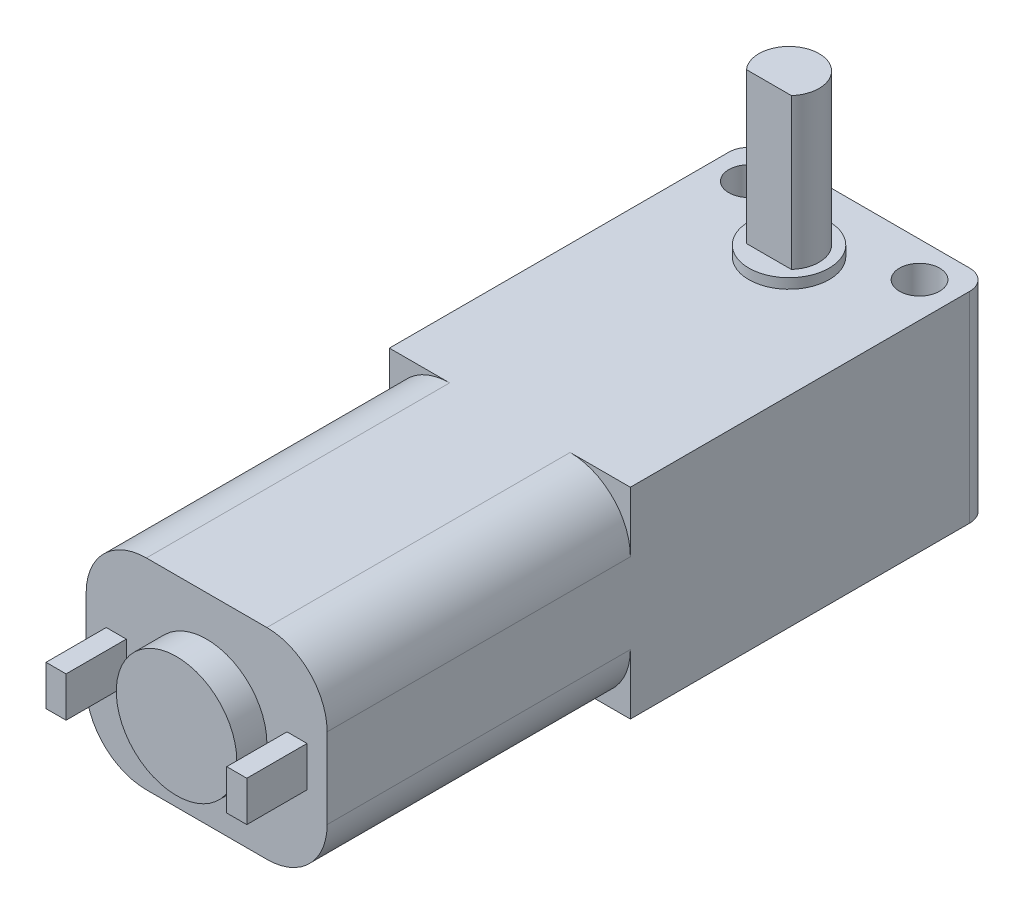
ISO-10303-21;
HEADER;
FILE_DESCRIPTION(('STEP AP214'),'2;1');
FILE_NAME('part.step','',(''),(''),'','','');
FILE_SCHEMA(('AUTOMOTIVE_DESIGN { 1 0 10303 214 1 1 1 1 }'));
ENDSEC;
DATA;
#1=APPLICATION_CONTEXT('core data for automotive mechanical design processes');
#2=APPLICATION_PROTOCOL_DEFINITION('international standard','automotive_design',2000,#1);
#3=PRODUCT_CONTEXT('',#1,'mechanical');
#4=PRODUCT('Part','Part','',(#3));
#5=PRODUCT_RELATED_PRODUCT_CATEGORY('part','',(#4));
#6=PRODUCT_DEFINITION_FORMATION('','',#4);
#7=PRODUCT_DEFINITION_CONTEXT('part definition',#1,'design');
#8=PRODUCT_DEFINITION('design','',#6,#7);
#9=PRODUCT_DEFINITION_SHAPE('','',#8);
#10=(LENGTH_UNIT() NAMED_UNIT(*) SI_UNIT(.MILLI.,.METRE.));
#11=(NAMED_UNIT(*) PLANE_ANGLE_UNIT() SI_UNIT($,.RADIAN.));
#12=(NAMED_UNIT(*) SI_UNIT($,.STERADIAN.) SOLID_ANGLE_UNIT());
#13=UNCERTAINTY_MEASURE_WITH_UNIT(LENGTH_MEASURE(1.E-05),#10,'distance_accuracy_value','');
#14=(GEOMETRIC_REPRESENTATION_CONTEXT(3) GLOBAL_UNCERTAINTY_ASSIGNED_CONTEXT((#13)) GLOBAL_UNIT_ASSIGNED_CONTEXT((#10,
#11,#12)) REPRESENTATION_CONTEXT('',''));
#15=CARTESIAN_POINT('',(0.,0.,0.));
#16=DIRECTION('',(0.,0.,1.));
#17=DIRECTION('',(1.,0.,0.));
#18=AXIS2_PLACEMENT_3D('',#15,#16,#17);
#19=CARTESIAN_POINT('',(-6.,10.,16.5));
#20=DIRECTION('',(0.,0.,-1.));
#21=DIRECTION('',(-1.,0.,0.));
#22=AXIS2_PLACEMENT_3D('',#19,#20,#21);
#23=PLANE('',#22);
#24=DIRECTION('',(0.,-1.,0.));
#25=VECTOR('',#24,1.);
#26=CARTESIAN_POINT('',(-5.,5.99999999999999,16.5));
#27=LINE('',#26,#25);
#28=CARTESIAN_POINT('',(-5.,5.99999999999999,16.5));
#29=VERTEX_POINT('',#28);
#30=CARTESIAN_POINT('',(-5.,3.99999999999999,16.5));
#31=VERTEX_POINT('',#30);
#32=EDGE_CURVE('E305',#29,#31,#27,.T.);
#33=ORIENTED_EDGE('',*,*,#32,.F.);
#34=DIRECTION('',(-1.,0.,0.));
#35=VECTOR('',#34,1.);
#36=CARTESIAN_POINT('',(-5.,5.99999999999999,16.5));
#37=LINE('',#36,#35);
#38=CARTESIAN_POINT('',(-4.,5.99999999999999,16.5));
#39=VERTEX_POINT('',#38);
#40=EDGE_CURVE('E310',#39,#29,#37,.T.);
#41=ORIENTED_EDGE('',*,*,#40,.F.);
#42=DIRECTION('',(0.,1.,0.));
#43=VECTOR('',#42,1.);
#44=CARTESIAN_POINT('',(-4.,5.99999999999999,16.5));
#45=LINE('',#44,#43);
#46=CARTESIAN_POINT('',(-4.,3.99999999999999,16.5));
#47=VERTEX_POINT('',#46);
#48=EDGE_CURVE('E322',#47,#39,#45,.T.);
#49=ORIENTED_EDGE('',*,*,#48,.F.);
#50=DIRECTION('',(1.,0.,0.));
#51=VECTOR('',#50,1.);
#52=CARTESIAN_POINT('',(-5.,3.99999999999999,16.5));
#53=LINE('',#52,#51);
#54=EDGE_CURVE('E319',#31,#47,#53,.T.);
#55=ORIENTED_EDGE('',*,*,#54,.F.);
#56=EDGE_LOOP('',(#33,#41,#49,#55));
#57=FACE_BOUND('',#56,.T.);
#58=CARTESIAN_POINT('',(0.,4.99999999999999,16.5));
#59=DIRECTION('',(0.,0.,1.));
#60=DIRECTION('',(1.,0.,0.));
#61=AXIS2_PLACEMENT_3D('',#58,#59,#60);
#62=CIRCLE('',#61,3.);
#63=CARTESIAN_POINT('',(3.,4.99999999999999,16.5));
#64=VERTEX_POINT('',#63);
#65=EDGE_CURVE('E255',#64,#64,#62,.T.);
#66=ORIENTED_EDGE('',*,*,#65,.F.);
#67=EDGE_LOOP('',(#66));
#68=FACE_BOUND('',#67,.T.);
#69=CARTESIAN_POINT('',(-3.,7.,16.5));
#70=DIRECTION('',(0.,0.,1.));
#71=DIRECTION('',(1.,0.,0.));
#72=AXIS2_PLACEMENT_3D('',#69,#70,#71);
#73=CIRCLE('',#72,3.);
#74=CARTESIAN_POINT('',(-3.,10.,16.5));
#75=VERTEX_POINT('',#74);
#76=CARTESIAN_POINT('',(-6.,6.99999999999998,16.5));
#77=VERTEX_POINT('',#76);
#78=EDGE_CURVE('E340',#75,#77,#73,.T.);
#79=ORIENTED_EDGE('',*,*,#78,.T.);
#80=DIRECTION('',(0.,-1.,0.));
#81=VECTOR('',#80,1.);
#82=CARTESIAN_POINT('',(-6.,10.,16.5));
#83=LINE('',#82,#81);
#84=CARTESIAN_POINT('',(-6.,3.00000000000002,16.5));
#85=VERTEX_POINT('',#84);
#86=EDGE_CURVE('E415',#77,#85,#83,.T.);
#87=ORIENTED_EDGE('',*,*,#86,.T.);
#88=CARTESIAN_POINT('',(-3.,3.,16.5));
#89=DIRECTION('',(0.,0.,1.));
#90=DIRECTION('',(1.,0.,0.));
#91=AXIS2_PLACEMENT_3D('',#88,#89,#90);
#92=CIRCLE('',#91,3.);
#93=CARTESIAN_POINT('',(-2.99999999999998,0.,16.5));
#94=VERTEX_POINT('',#93);
#95=EDGE_CURVE('E356',#85,#94,#92,.T.);
#96=ORIENTED_EDGE('',*,*,#95,.T.);
#97=DIRECTION('',(1.,0.,0.));
#98=VECTOR('',#97,1.);
#99=CARTESIAN_POINT('',(-6.,0.,16.5));
#100=LINE('',#99,#98);
#101=CARTESIAN_POINT('',(3.,0.,16.5));
#102=VERTEX_POINT('',#101);
#103=EDGE_CURVE('E406',#94,#102,#100,.T.);
#104=ORIENTED_EDGE('',*,*,#103,.T.);
#105=CARTESIAN_POINT('',(3.,3.,16.5));
#106=DIRECTION('',(0.,0.,1.));
#107=DIRECTION('',(1.,0.,0.));
#108=AXIS2_PLACEMENT_3D('',#105,#106,#107);
#109=CIRCLE('',#108,3.);
#110=CARTESIAN_POINT('',(6.,3.,16.5));
#111=VERTEX_POINT('',#110);
#112=EDGE_CURVE('E359',#102,#111,#109,.T.);
#113=ORIENTED_EDGE('',*,*,#112,.T.);
#114=DIRECTION('',(0.,-1.,0.));
#115=VECTOR('',#114,1.);
#116=CARTESIAN_POINT('',(6.,10.,16.5));
#117=LINE('',#116,#115);
#118=CARTESIAN_POINT('',(6.,6.99999999999998,16.5));
#119=VERTEX_POINT('',#118);
#120=EDGE_CURVE('E403',#119,#111,#117,.T.);
#121=ORIENTED_EDGE('',*,*,#120,.F.);
#122=CARTESIAN_POINT('',(3.,7.,16.5));
#123=DIRECTION('',(0.,0.,-1.));
#124=DIRECTION('',(-1.,0.,0.));
#125=AXIS2_PLACEMENT_3D('',#122,#123,#124);
#126=CIRCLE('',#125,3.);
#127=CARTESIAN_POINT('',(2.99999999999998,10.,16.5));
#128=VERTEX_POINT('',#127);
#129=EDGE_CURVE('E346',#128,#119,#126,.T.);
#130=ORIENTED_EDGE('',*,*,#129,.F.);
#131=DIRECTION('',(1.,0.,0.));
#132=VECTOR('',#131,1.);
#133=CARTESIAN_POINT('',(-6.,10.,16.5));
#134=LINE('',#133,#132);
#135=EDGE_CURVE('E395',#75,#128,#134,.T.);
#136=ORIENTED_EDGE('',*,*,#135,.F.);
#137=EDGE_LOOP('',(#79,#87,#96,#104,#113,#121,#130,#136));
#138=FACE_BOUND('',#137,.T.);
#139=DIRECTION('',(0.,1.,0.));
#140=VECTOR('',#139,1.);
#141=CARTESIAN_POINT('',(4.99999999999999,6.,16.5));
#142=LINE('',#141,#140);
#143=CARTESIAN_POINT('',(4.99999999999999,4.,16.5));
#144=VERTEX_POINT('',#143);
#145=CARTESIAN_POINT('',(4.99999999999999,6.,16.5));
#146=VERTEX_POINT('',#145);
#147=EDGE_CURVE('E269',#144,#146,#142,.T.);
#148=ORIENTED_EDGE('',*,*,#147,.F.);
#149=DIRECTION('',(1.,0.,0.));
#150=VECTOR('',#149,1.);
#151=CARTESIAN_POINT('',(4.99999999999999,4.,16.5));
#152=LINE('',#151,#150);
#153=CARTESIAN_POINT('',(3.99999999999999,4.,16.5));
#154=VERTEX_POINT('',#153);
#155=EDGE_CURVE('E277',#154,#144,#152,.T.);
#156=ORIENTED_EDGE('',*,*,#155,.F.);
#157=DIRECTION('',(0.,-1.,0.));
#158=VECTOR('',#157,1.);
#159=CARTESIAN_POINT('',(3.99999999999999,6.,16.5));
#160=LINE('',#159,#158);
#161=CARTESIAN_POINT('',(3.99999999999999,6.,16.5));
#162=VERTEX_POINT('',#161);
#163=EDGE_CURVE('E289',#162,#154,#160,.T.);
#164=ORIENTED_EDGE('',*,*,#163,.F.);
#165=DIRECTION('',(-1.,0.,0.));
#166=VECTOR('',#165,1.);
#167=CARTESIAN_POINT('',(4.99999999999999,6.,16.5));
#168=LINE('',#167,#166);
#169=EDGE_CURVE('E286',#146,#162,#168,.T.);
#170=ORIENTED_EDGE('',*,*,#169,.F.);
#171=EDGE_LOOP('',(#148,#156,#164,#170));
#172=FACE_BOUND('',#171,.T.);
#173=ADVANCED_FACE('F71',(#57,#68,#138,#172),#23,.F.);
#174=CARTESIAN_POINT('',(-6.,10.,-16.5));
#175=DIRECTION('',(1.,0.,0.));
#176=DIRECTION('',(0.,0.,-1.));
#177=AXIS2_PLACEMENT_3D('',#174,#175,#176);
#178=PLANE('',#177);
#179=DIRECTION('',(0.,0.,1.));
#180=VECTOR('',#179,1.);
#181=CARTESIAN_POINT('',(-6.,10.,-16.5));
#182=LINE('',#181,#180);
#183=CARTESIAN_POINT('',(-6.,10.,-15.5));
#184=VERTEX_POINT('',#183);
#185=CARTESIAN_POINT('',(-6.,10.,1.4));
#186=VERTEX_POINT('',#185);
#187=EDGE_CURVE('E393',#184,#186,#182,.T.);
#188=ORIENTED_EDGE('',*,*,#187,.F.);
#189=DIRECTION('',(0.,-1.,0.));
#190=VECTOR('',#189,1.);
#191=CARTESIAN_POINT('',(-6.,10.,-15.5));
#192=LINE('',#191,#190);
#193=CARTESIAN_POINT('',(-6.,0.,-15.5));
#194=VERTEX_POINT('',#193);
#195=EDGE_CURVE('E13',#184,#194,#192,.T.);
#196=ORIENTED_EDGE('',*,*,#195,.T.);
#197=DIRECTION('',(0.,0.,1.));
#198=VECTOR('',#197,1.);
#199=CARTESIAN_POINT('',(-6.,0.,-16.5));
#200=LINE('',#199,#198);
#201=CARTESIAN_POINT('',(-6.,0.,1.4));
#202=VERTEX_POINT('',#201);
#203=EDGE_CURVE('E404',#194,#202,#200,.T.);
#204=ORIENTED_EDGE('',*,*,#203,.T.);
#205=DIRECTION('',(0.,-1.,0.));
#206=VECTOR('',#205,1.);
#207=CARTESIAN_POINT('',(-6.,10.,1.4));
#208=LINE('',#207,#206);
#209=CARTESIAN_POINT('',(-6.,3.00000000000002,1.4));
#210=VERTEX_POINT('',#209);
#211=EDGE_CURVE('E384',#210,#202,#208,.T.);
#212=ORIENTED_EDGE('',*,*,#211,.F.);
#213=DIRECTION('',(0.,0.,1.));
#214=VECTOR('',#213,1.);
#215=CARTESIAN_POINT('',(-6.,3.00000000000002,1.4));
#216=LINE('',#215,#214);
#217=EDGE_CURVE('E379',#210,#85,#216,.T.);
#218=ORIENTED_EDGE('',*,*,#217,.T.);
#219=ORIENTED_EDGE('',*,*,#86,.F.);
#220=DIRECTION('',(0.,0.,1.));
#221=VECTOR('',#220,1.);
#222=CARTESIAN_POINT('',(-6.,6.99999999999998,1.4));
#223=LINE('',#222,#221);
#224=CARTESIAN_POINT('',(-6.,6.99999999999998,1.4));
#225=VERTEX_POINT('',#224);
#226=EDGE_CURVE('E353',#225,#77,#223,.T.);
#227=ORIENTED_EDGE('',*,*,#226,.F.);
#228=EDGE_CURVE('E389',#186,#225,#208,.T.);
#229=ORIENTED_EDGE('',*,*,#228,.F.);
#230=EDGE_LOOP('',(#188,#196,#204,#212,#218,#219,#227,#229));
#231=FACE_BOUND('',#230,.T.);
#232=ADVANCED_FACE('F463',(#231),#178,.F.);
#233=CARTESIAN_POINT('',(6.,10.,-16.5));
#234=DIRECTION('',(-1.,0.,0.));
#235=DIRECTION('',(0.,0.,1.));
#236=AXIS2_PLACEMENT_3D('',#233,#234,#235);
#237=PLANE('',#236);
#238=DIRECTION('',(0.,0.,-1.));
#239=VECTOR('',#238,1.);
#240=CARTESIAN_POINT('',(6.,0.,-16.5));
#241=LINE('',#240,#239);
#242=CARTESIAN_POINT('',(6.,0.,1.4));
#243=VERTEX_POINT('',#242);
#244=CARTESIAN_POINT('',(6.,0.,-15.5));
#245=VERTEX_POINT('',#244);
#246=EDGE_CURVE('E409',#243,#245,#241,.T.);
#247=ORIENTED_EDGE('',*,*,#246,.T.);
#248=DIRECTION('',(0.,-1.,0.));
#249=VECTOR('',#248,1.);
#250=CARTESIAN_POINT('',(6.,10.,-15.5));
#251=LINE('',#250,#249);
#252=CARTESIAN_POINT('',(6.,10.,-15.5));
#253=VERTEX_POINT('',#252);
#254=EDGE_CURVE('E94',#245,#253,#251,.F.);
#255=ORIENTED_EDGE('',*,*,#254,.T.);
#256=DIRECTION('',(0.,0.,-1.));
#257=VECTOR('',#256,1.);
#258=CARTESIAN_POINT('',(6.,10.,-16.5));
#259=LINE('',#258,#257);
#260=CARTESIAN_POINT('',(6.,10.,1.4));
#261=VERTEX_POINT('',#260);
#262=EDGE_CURVE('E399',#261,#253,#259,.T.);
#263=ORIENTED_EDGE('',*,*,#262,.F.);
#264=DIRECTION('',(0.,1.,0.));
#265=VECTOR('',#264,1.);
#266=CARTESIAN_POINT('',(6.,10.,1.4));
#267=LINE('',#266,#265);
#268=CARTESIAN_POINT('',(6.,6.99999999999998,1.4));
#269=VERTEX_POINT('',#268);
#270=EDGE_CURVE('E385',#269,#261,#267,.T.);
#271=ORIENTED_EDGE('',*,*,#270,.F.);
#272=DIRECTION('',(0.,0.,1.));
#273=VECTOR('',#272,1.);
#274=CARTESIAN_POINT('',(6.,6.99999999999998,1.4));
#275=LINE('',#274,#273);
#276=EDGE_CURVE('E369',#269,#119,#275,.T.);
#277=ORIENTED_EDGE('',*,*,#276,.T.);
#278=ORIENTED_EDGE('',*,*,#120,.T.);
#279=DIRECTION('',(0.,0.,1.));
#280=VECTOR('',#279,1.);
#281=CARTESIAN_POINT('',(6.,3.,1.4));
#282=LINE('',#281,#280);
#283=CARTESIAN_POINT('',(6.,3.,1.4));
#284=VERTEX_POINT('',#283);
#285=EDGE_CURVE('E372',#284,#111,#282,.T.);
#286=ORIENTED_EDGE('',*,*,#285,.F.);
#287=EDGE_CURVE('E366',#243,#284,#267,.T.);
#288=ORIENTED_EDGE('',*,*,#287,.F.);
#289=EDGE_LOOP('',(#247,#255,#263,#271,#277,#278,#286,#288));
#290=FACE_BOUND('',#289,.T.);
#291=ADVANCED_FACE('F445',(#290),#237,.F.);
#292=CARTESIAN_POINT('',(0.,10.,0.));
#293=DIRECTION('',(0.,1.,0.));
#294=DIRECTION('',(0.,0.,1.));
#295=AXIS2_PLACEMENT_3D('',#292,#293,#294);
#296=PLANE('',#295);
#297=CARTESIAN_POINT('',(-4.25,10.,-14.75));
#298=DIRECTION('',(0.,1.,0.));
#299=DIRECTION('',(0.,0.,1.));
#300=AXIS2_PLACEMENT_3D('',#297,#298,#299);
#301=CIRCLE('',#300,1.);
#302=CARTESIAN_POINT('',(-4.25,10.,-13.75));
#303=VERTEX_POINT('',#302);
#304=EDGE_CURVE('E602',#303,#303,#301,.T.);
#305=ORIENTED_EDGE('',*,*,#304,.F.);
#306=EDGE_LOOP('',(#305));
#307=FACE_BOUND('',#306,.T.);
#308=CARTESIAN_POINT('',(4.25,10.,-14.75));
#309=DIRECTION('',(0.,1.,0.));
#310=DIRECTION('',(0.,0.,1.));
#311=AXIS2_PLACEMENT_3D('',#308,#309,#310);
#312=CIRCLE('',#311,1.);
#313=CARTESIAN_POINT('',(4.25,10.,-13.75));
#314=VERTEX_POINT('',#313);
#315=EDGE_CURVE('E606',#314,#314,#312,.T.);
#316=ORIENTED_EDGE('',*,*,#315,.F.);
#317=EDGE_LOOP('',(#316));
#318=FACE_BOUND('',#317,.T.);
#319=CARTESIAN_POINT('',(0.,10.,-12.5));
#320=DIRECTION('',(0.,1.,0.));
#321=DIRECTION('',(0.,0.,1.));
#322=AXIS2_PLACEMENT_3D('',#319,#320,#321);
#323=CIRCLE('',#322,2.);
#324=CARTESIAN_POINT('',(0.,10.,-10.5));
#325=VERTEX_POINT('',#324);
#326=EDGE_CURVE('E270',#325,#325,#323,.T.);
#327=ORIENTED_EDGE('',*,*,#326,.F.);
#328=EDGE_LOOP('',(#327));
#329=FACE_BOUND('',#328,.T.);
#330=ORIENTED_EDGE('',*,*,#262,.T.);
#331=CARTESIAN_POINT('',(5.,10.,-15.5));
#332=DIRECTION('',(0.,1.,0.));
#333=DIRECTION('',(0.,0.,1.));
#334=AXIS2_PLACEMENT_3D('',#331,#332,#333);
#335=CIRCLE('',#334,1.);
#336=CARTESIAN_POINT('',(5.,10.,-16.5));
#337=VERTEX_POINT('',#336);
#338=EDGE_CURVE('E79',#253,#337,#335,.T.);
#339=ORIENTED_EDGE('',*,*,#338,.T.);
#340=DIRECTION('',(-1.,0.,0.));
#341=VECTOR('',#340,1.);
#342=CARTESIAN_POINT('',(-6.,10.,-16.5));
#343=LINE('',#342,#341);
#344=CARTESIAN_POINT('',(-5.,10.,-16.5));
#345=VERTEX_POINT('',#344);
#346=EDGE_CURVE('E401',#337,#345,#343,.T.);
#347=ORIENTED_EDGE('',*,*,#346,.T.);
#348=CARTESIAN_POINT('',(-5.,10.,-15.5));
#349=DIRECTION('',(0.,1.,0.));
#350=DIRECTION('',(0.,0.,1.));
#351=AXIS2_PLACEMENT_3D('',#348,#349,#350);
#352=CIRCLE('',#351,1.);
#353=EDGE_CURVE('E86',#345,#184,#352,.T.);
#354=ORIENTED_EDGE('',*,*,#353,.T.);
#355=ORIENTED_EDGE('',*,*,#187,.T.);
#356=DIRECTION('',(1.,0.,0.));
#357=VECTOR('',#356,1.);
#358=CARTESIAN_POINT('',(0.,10.,1.4));
#359=LINE('',#358,#357);
#360=CARTESIAN_POINT('',(-2.99999999999998,10.,1.4));
#361=VERTEX_POINT('',#360);
#362=EDGE_CURVE('E392',#186,#361,#359,.T.);
#363=ORIENTED_EDGE('',*,*,#362,.T.);
#364=DIRECTION('',(0.,0.,1.));
#365=VECTOR('',#364,1.);
#366=CARTESIAN_POINT('',(-2.99999999999998,10.,1.4));
#367=LINE('',#366,#365);
#368=EDGE_CURVE('E363',#361,#75,#367,.T.);
#369=ORIENTED_EDGE('',*,*,#368,.T.);
#370=ORIENTED_EDGE('',*,*,#135,.T.);
#371=DIRECTION('',(0.,0.,1.));
#372=VECTOR('',#371,1.);
#373=CARTESIAN_POINT('',(2.99999999999998,10.,1.4));
#374=LINE('',#373,#372);
#375=CARTESIAN_POINT('',(3.,10.,1.4));
#376=VERTEX_POINT('',#375);
#377=EDGE_CURVE('E367',#376,#128,#374,.T.);
#378=ORIENTED_EDGE('',*,*,#377,.F.);
#379=EDGE_CURVE('E388',#376,#261,#359,.T.);
#380=ORIENTED_EDGE('',*,*,#379,.T.);
#381=EDGE_LOOP('',(#330,#339,#347,#354,#355,#363,#369,#370,#378,#380));
#382=FACE_BOUND('',#381,.T.);
#383=ADVANCED_FACE('F432',(#307,#318,#329,#382),#296,.T.);
#384=CARTESIAN_POINT('',(-6.,10.,-16.5));
#385=DIRECTION('',(0.,0.,1.));
#386=DIRECTION('',(1.,0.,0.));
#387=AXIS2_PLACEMENT_3D('',#384,#385,#386);
#388=PLANE('',#387);
#389=ORIENTED_EDGE('',*,*,#346,.F.);
#390=DIRECTION('',(0.,-1.,0.));
#391=VECTOR('',#390,1.);
#392=CARTESIAN_POINT('',(5.,10.,-16.5));
#393=LINE('',#392,#391);
#394=CARTESIAN_POINT('',(5.,0.,-16.5));
#395=VERTEX_POINT('',#394);
#396=EDGE_CURVE('E422',#337,#395,#393,.T.);
#397=ORIENTED_EDGE('',*,*,#396,.T.);
#398=DIRECTION('',(-1.,0.,0.));
#399=VECTOR('',#398,1.);
#400=CARTESIAN_POINT('',(-6.,0.,-16.5));
#401=LINE('',#400,#399);
#402=CARTESIAN_POINT('',(-5.,0.,-16.5));
#403=VERTEX_POINT('',#402);
#404=EDGE_CURVE('E396',#395,#403,#401,.T.);
#405=ORIENTED_EDGE('',*,*,#404,.T.);
#406=DIRECTION('',(0.,-1.,0.));
#407=VECTOR('',#406,1.);
#408=CARTESIAN_POINT('',(-5.,10.,-16.5));
#409=LINE('',#408,#407);
#410=EDGE_CURVE('E257',#403,#345,#409,.F.);
#411=ORIENTED_EDGE('',*,*,#410,.T.);
#412=EDGE_LOOP('',(#389,#397,#405,#411));
#413=FACE_BOUND('',#412,.T.);
#414=ADVANCED_FACE('F436',(#413),#388,.F.);
#415=CARTESIAN_POINT('',(0.,0.,0.));
#416=DIRECTION('',(0.,1.,0.));
#417=DIRECTION('',(0.,0.,1.));
#418=AXIS2_PLACEMENT_3D('',#415,#416,#417);
#419=PLANE('',#418);
#420=CARTESIAN_POINT('',(-4.25,0.,-14.75));
#421=DIRECTION('',(0.,1.,0.));
#422=DIRECTION('',(0.,0.,1.));
#423=AXIS2_PLACEMENT_3D('',#420,#421,#422);
#424=CIRCLE('',#423,1.);
#425=CARTESIAN_POINT('',(-4.25,0.,-13.75));
#426=VERTEX_POINT('',#425);
#427=EDGE_CURVE('E252',#426,#426,#424,.T.);
#428=ORIENTED_EDGE('',*,*,#427,.T.);
#429=EDGE_LOOP('',(#428));
#430=FACE_BOUND('',#429,.T.);
#431=CARTESIAN_POINT('',(4.25,0.,-14.75));
#432=DIRECTION('',(0.,1.,0.));
#433=DIRECTION('',(0.,0.,1.));
#434=AXIS2_PLACEMENT_3D('',#431,#432,#433);
#435=CIRCLE('',#434,1.);
#436=CARTESIAN_POINT('',(4.25,0.,-13.75));
#437=VERTEX_POINT('',#436);
#438=EDGE_CURVE('E610',#437,#437,#435,.T.);
#439=ORIENTED_EDGE('',*,*,#438,.T.);
#440=EDGE_LOOP('',(#439));
#441=FACE_BOUND('',#440,.T.);
#442=ORIENTED_EDGE('',*,*,#404,.F.);
#443=CARTESIAN_POINT('',(5.,0.,-15.5));
#444=DIRECTION('',(0.,1.,0.));
#445=DIRECTION('',(0.,0.,1.));
#446=AXIS2_PLACEMENT_3D('',#443,#444,#445);
#447=CIRCLE('',#446,1.);
#448=EDGE_CURVE('E427',#395,#245,#447,.F.);
#449=ORIENTED_EDGE('',*,*,#448,.T.);
#450=ORIENTED_EDGE('',*,*,#246,.F.);
#451=DIRECTION('',(1.,0.,0.));
#452=VECTOR('',#451,1.);
#453=CARTESIAN_POINT('',(0.,0.,1.4));
#454=LINE('',#453,#452);
#455=CARTESIAN_POINT('',(2.99999999999998,0.,1.4));
#456=VERTEX_POINT('',#455);
#457=EDGE_CURVE('E418',#456,#243,#454,.T.);
#458=ORIENTED_EDGE('',*,*,#457,.F.);
#459=DIRECTION('',(0.,0.,1.));
#460=VECTOR('',#459,1.);
#461=CARTESIAN_POINT('',(2.99999999999998,0.,1.4));
#462=LINE('',#461,#460);
#463=EDGE_CURVE('E374',#456,#102,#462,.T.);
#464=ORIENTED_EDGE('',*,*,#463,.T.);
#465=ORIENTED_EDGE('',*,*,#103,.F.);
#466=DIRECTION('',(0.,0.,1.));
#467=VECTOR('',#466,1.);
#468=CARTESIAN_POINT('',(-2.99999999999998,0.,1.4));
#469=LINE('',#468,#467);
#470=CARTESIAN_POINT('',(-3.,0.,1.4));
#471=VERTEX_POINT('',#470);
#472=EDGE_CURVE('E377',#471,#94,#469,.T.);
#473=ORIENTED_EDGE('',*,*,#472,.F.);
#474=EDGE_CURVE('E260',#202,#471,#454,.T.);
#475=ORIENTED_EDGE('',*,*,#474,.F.);
#476=ORIENTED_EDGE('',*,*,#203,.F.);
#477=CARTESIAN_POINT('',(-5.,0.,-15.5));
#478=DIRECTION('',(0.,1.,0.));
#479=DIRECTION('',(0.,0.,1.));
#480=AXIS2_PLACEMENT_3D('',#477,#478,#479);
#481=CIRCLE('',#480,1.);
#482=EDGE_CURVE('E425',#194,#403,#481,.F.);
#483=ORIENTED_EDGE('',*,*,#482,.T.);
#484=EDGE_LOOP('',(#442,#449,#450,#458,#464,#465,#473,#475,#476,#483));
#485=FACE_BOUND('',#484,.T.);
#486=ADVANCED_FACE('F442',(#430,#441,#485),#419,.F.);
#487=CARTESIAN_POINT('',(-3.,3.,1.4));
#488=DIRECTION('',(0.,0.,1.));
#489=DIRECTION('',(1.,0.,0.));
#490=AXIS2_PLACEMENT_3D('',#487,#488,#489);
#491=CYLINDRICAL_SURFACE('',#490,3.);
#492=ORIENTED_EDGE('',*,*,#95,.F.);
#493=ORIENTED_EDGE('',*,*,#217,.F.);
#494=CARTESIAN_POINT('',(-3.,3.,1.4));
#495=DIRECTION('',(0.,0.,1.));
#496=DIRECTION('',(1.,0.,0.));
#497=AXIS2_PLACEMENT_3D('',#494,#495,#496);
#498=CIRCLE('',#497,3.);
#499=EDGE_CURVE('E345',#210,#471,#498,.T.);
#500=ORIENTED_EDGE('',*,*,#499,.T.);
#501=ORIENTED_EDGE('',*,*,#472,.T.);
#502=EDGE_LOOP('',(#492,#493,#500,#501));
#503=FACE_BOUND('',#502,.T.);
#504=ADVANCED_FACE('F460',(#503),#491,.T.);
#505=CARTESIAN_POINT('',(0.,5.,1.4));
#506=DIRECTION('',(0.,0.,1.));
#507=DIRECTION('',(1.,0.,0.));
#508=AXIS2_PLACEMENT_3D('',#505,#506,#507);
#509=PLANE('',#508);
#510=ORIENTED_EDGE('',*,*,#211,.T.);
#511=ORIENTED_EDGE('',*,*,#474,.T.);
#512=ORIENTED_EDGE('',*,*,#499,.F.);
#513=EDGE_LOOP('',(#510,#511,#512));
#514=FACE_BOUND('',#513,.T.);
#515=ADVANCED_FACE('F468',(#514),#509,.T.);
#516=CARTESIAN_POINT('',(3.,3.,1.4));
#517=DIRECTION('',(0.,0.,1.));
#518=DIRECTION('',(1.,0.,0.));
#519=AXIS2_PLACEMENT_3D('',#516,#517,#518);
#520=CYLINDRICAL_SURFACE('',#519,3.);
#521=ORIENTED_EDGE('',*,*,#112,.F.);
#522=ORIENTED_EDGE('',*,*,#463,.F.);
#523=CARTESIAN_POINT('',(3.,3.,1.4));
#524=DIRECTION('',(0.,0.,1.));
#525=DIRECTION('',(1.,0.,0.));
#526=AXIS2_PLACEMENT_3D('',#523,#524,#525);
#527=CIRCLE('',#526,3.);
#528=EDGE_CURVE('E348',#456,#284,#527,.T.);
#529=ORIENTED_EDGE('',*,*,#528,.T.);
#530=ORIENTED_EDGE('',*,*,#285,.T.);
#531=EDGE_LOOP('',(#521,#522,#529,#530));
#532=FACE_BOUND('',#531,.T.);
#533=ADVANCED_FACE('F451',(#532),#520,.T.);
#534=ORIENTED_EDGE('',*,*,#287,.T.);
#535=ORIENTED_EDGE('',*,*,#528,.F.);
#536=ORIENTED_EDGE('',*,*,#457,.T.);
#537=EDGE_LOOP('',(#534,#535,#536));
#538=FACE_BOUND('',#537,.T.);
#539=ADVANCED_FACE('F449',(#538),#509,.T.);
#540=CARTESIAN_POINT('',(3.,7.,1.4));
#541=DIRECTION('',(0.,0.,1.));
#542=DIRECTION('',(1.,0.,0.));
#543=AXIS2_PLACEMENT_3D('',#540,#541,#542);
#544=CYLINDRICAL_SURFACE('',#543,3.);
#545=ORIENTED_EDGE('',*,*,#129,.T.);
#546=ORIENTED_EDGE('',*,*,#276,.F.);
#547=CARTESIAN_POINT('',(3.,7.,1.4));
#548=DIRECTION('',(0.,0.,-1.));
#549=DIRECTION('',(-1.,0.,0.));
#550=AXIS2_PLACEMENT_3D('',#547,#548,#549);
#551=CIRCLE('',#550,3.);
#552=EDGE_CURVE('E351',#376,#269,#551,.T.);
#553=ORIENTED_EDGE('',*,*,#552,.F.);
#554=ORIENTED_EDGE('',*,*,#377,.T.);
#555=EDGE_LOOP('',(#545,#546,#553,#554));
#556=FACE_BOUND('',#555,.T.);
#557=ADVANCED_FACE('F486',(#556),#544,.T.);
#558=ORIENTED_EDGE('',*,*,#270,.T.);
#559=ORIENTED_EDGE('',*,*,#379,.F.);
#560=ORIENTED_EDGE('',*,*,#552,.T.);
#561=EDGE_LOOP('',(#558,#559,#560));
#562=FACE_BOUND('',#561,.T.);
#563=ADVANCED_FACE('F480',(#562),#509,.T.);
#564=ORIENTED_EDGE('',*,*,#228,.T.);
#565=CARTESIAN_POINT('',(-3.,7.,1.4));
#566=DIRECTION('',(0.,0.,1.));
#567=DIRECTION('',(1.,0.,0.));
#568=AXIS2_PLACEMENT_3D('',#565,#566,#567);
#569=CIRCLE('',#568,3.);
#570=EDGE_CURVE('E342',#361,#225,#569,.T.);
#571=ORIENTED_EDGE('',*,*,#570,.F.);
#572=ORIENTED_EDGE('',*,*,#362,.F.);
#573=EDGE_LOOP('',(#564,#571,#572));
#574=FACE_BOUND('',#573,.T.);
#575=ADVANCED_FACE('F476',(#574),#509,.T.);
#576=CARTESIAN_POINT('',(-3.,7.,1.4));
#577=DIRECTION('',(0.,0.,1.));
#578=DIRECTION('',(1.,0.,0.));
#579=AXIS2_PLACEMENT_3D('',#576,#577,#578);
#580=CYLINDRICAL_SURFACE('',#579,3.);
#581=ORIENTED_EDGE('',*,*,#78,.F.);
#582=ORIENTED_EDGE('',*,*,#368,.F.);
#583=ORIENTED_EDGE('',*,*,#570,.T.);
#584=ORIENTED_EDGE('',*,*,#226,.T.);
#585=EDGE_LOOP('',(#581,#582,#583,#584));
#586=FACE_BOUND('',#585,.T.);
#587=ADVANCED_FACE('F488',(#586),#580,.T.);
#588=CARTESIAN_POINT('',(0.,4.99999999999999,18.));
#589=DIRECTION('',(0.,0.,-1.));
#590=DIRECTION('',(-1.,0.,0.));
#591=AXIS2_PLACEMENT_3D('',#588,#589,#590);
#592=CYLINDRICAL_SURFACE('',#591,3.);
#593=CARTESIAN_POINT('',(0.,4.99999999999999,18.));
#594=DIRECTION('',(0.,0.,1.));
#595=DIRECTION('',(1.,0.,0.));
#596=AXIS2_PLACEMENT_3D('',#593,#594,#595);
#597=CIRCLE('',#596,3.);
#598=CARTESIAN_POINT('',(3.,4.99999999999999,18.));
#599=VERTEX_POINT('',#598);
#600=EDGE_CURVE('E338',#599,#599,#597,.T.);
#601=ORIENTED_EDGE('',*,*,#600,.F.);
#602=EDGE_LOOP('',(#601));
#603=FACE_BOUND('',#602,.T.);
#604=ORIENTED_EDGE('',*,*,#65,.T.);
#605=EDGE_LOOP('',(#604));
#606=FACE_BOUND('',#605,.T.);
#607=ADVANCED_FACE('F490',(#603,#606),#592,.T.);
#608=CARTESIAN_POINT('',(0.,4.99999999999999,18.));
#609=DIRECTION('',(0.,0.,1.));
#610=DIRECTION('',(1.,0.,0.));
#611=AXIS2_PLACEMENT_3D('',#608,#609,#610);
#612=PLANE('',#611);
#613=ORIENTED_EDGE('',*,*,#600,.T.);
#614=EDGE_LOOP('',(#613));
#615=FACE_BOUND('',#614,.T.);
#616=ADVANCED_FACE('F496',(#615),#612,.T.);
#617=CARTESIAN_POINT('',(-5.,5.99999999999999,19.5));
#618=DIRECTION('',(1.,0.,0.));
#619=DIRECTION('',(0.,0.,-1.));
#620=AXIS2_PLACEMENT_3D('',#617,#618,#619);
#621=PLANE('',#620);
#622=ORIENTED_EDGE('',*,*,#32,.T.);
#623=DIRECTION('',(0.,0.,-1.));
#624=VECTOR('',#623,1.);
#625=CARTESIAN_POINT('',(-5.,3.99999999999999,19.5));
#626=LINE('',#625,#624);
#627=CARTESIAN_POINT('',(-5.,3.99999999999999,19.5));
#628=VERTEX_POINT('',#627);
#629=EDGE_CURVE('E335',#628,#31,#626,.T.);
#630=ORIENTED_EDGE('',*,*,#629,.F.);
#631=DIRECTION('',(0.,-1.,0.));
#632=VECTOR('',#631,1.);
#633=CARTESIAN_POINT('',(-5.,5.99999999999999,19.5));
#634=LINE('',#633,#632);
#635=CARTESIAN_POINT('',(-5.,5.99999999999999,19.5));
#636=VERTEX_POINT('',#635);
#637=EDGE_CURVE('E306',#636,#628,#634,.T.);
#638=ORIENTED_EDGE('',*,*,#637,.F.);
#639=DIRECTION('',(0.,0.,-1.));
#640=VECTOR('',#639,1.);
#641=CARTESIAN_POINT('',(-5.,5.99999999999999,19.5));
#642=LINE('',#641,#640);
#643=EDGE_CURVE('E316',#636,#29,#642,.T.);
#644=ORIENTED_EDGE('',*,*,#643,.T.);
#645=EDGE_LOOP('',(#622,#630,#638,#644));
#646=FACE_BOUND('',#645,.T.);
#647=ADVANCED_FACE('F570',(#646),#621,.F.);
#648=CARTESIAN_POINT('',(-5.,3.99999999999999,19.5));
#649=DIRECTION('',(0.,1.,0.));
#650=DIRECTION('',(0.,0.,1.));
#651=AXIS2_PLACEMENT_3D('',#648,#649,#650);
#652=PLANE('',#651);
#653=ORIENTED_EDGE('',*,*,#54,.T.);
#654=DIRECTION('',(0.,0.,-1.));
#655=VECTOR('',#654,1.);
#656=CARTESIAN_POINT('',(-4.,3.99999999999999,19.5));
#657=LINE('',#656,#655);
#658=CARTESIAN_POINT('',(-4.,3.99999999999999,19.5));
#659=VERTEX_POINT('',#658);
#660=EDGE_CURVE('E332',#659,#47,#657,.T.);
#661=ORIENTED_EDGE('',*,*,#660,.F.);
#662=DIRECTION('',(1.,0.,0.));
#663=VECTOR('',#662,1.);
#664=CARTESIAN_POINT('',(-5.,3.99999999999999,19.5));
#665=LINE('',#664,#663);
#666=EDGE_CURVE('E309',#628,#659,#665,.T.);
#667=ORIENTED_EDGE('',*,*,#666,.F.);
#668=ORIENTED_EDGE('',*,*,#629,.T.);
#669=EDGE_LOOP('',(#653,#661,#667,#668));
#670=FACE_BOUND('',#669,.T.);
#671=ADVANCED_FACE('F566',(#670),#652,.F.);
#672=CARTESIAN_POINT('',(-4.,5.99999999999999,19.5));
#673=DIRECTION('',(-1.,0.,0.));
#674=DIRECTION('',(0.,0.,1.));
#675=AXIS2_PLACEMENT_3D('',#672,#673,#674);
#676=PLANE('',#675);
#677=ORIENTED_EDGE('',*,*,#48,.T.);
#678=DIRECTION('',(0.,0.,-1.));
#679=VECTOR('',#678,1.);
#680=CARTESIAN_POINT('',(-4.,5.99999999999999,19.5));
#681=LINE('',#680,#679);
#682=CARTESIAN_POINT('',(-4.,5.99999999999999,19.5));
#683=VERTEX_POINT('',#682);
#684=EDGE_CURVE('E329',#683,#39,#681,.T.);
#685=ORIENTED_EDGE('',*,*,#684,.F.);
#686=DIRECTION('',(0.,1.,0.));
#687=VECTOR('',#686,1.);
#688=CARTESIAN_POINT('',(-4.,5.99999999999999,19.5));
#689=LINE('',#688,#687);
#690=EDGE_CURVE('E312',#659,#683,#689,.T.);
#691=ORIENTED_EDGE('',*,*,#690,.F.);
#692=ORIENTED_EDGE('',*,*,#660,.T.);
#693=EDGE_LOOP('',(#677,#685,#691,#692));
#694=FACE_BOUND('',#693,.T.);
#695=ADVANCED_FACE('F562',(#694),#676,.F.);
#696=CARTESIAN_POINT('',(-5.,5.99999999999999,19.5));
#697=DIRECTION('',(0.,-1.,0.));
#698=DIRECTION('',(0.,0.,-1.));
#699=AXIS2_PLACEMENT_3D('',#696,#697,#698);
#700=PLANE('',#699);
#701=ORIENTED_EDGE('',*,*,#40,.T.);
#702=ORIENTED_EDGE('',*,*,#643,.F.);
#703=DIRECTION('',(-1.,0.,0.));
#704=VECTOR('',#703,1.);
#705=CARTESIAN_POINT('',(-5.,5.99999999999999,19.5));
#706=LINE('',#705,#704);
#707=EDGE_CURVE('E314',#683,#636,#706,.T.);
#708=ORIENTED_EDGE('',*,*,#707,.F.);
#709=ORIENTED_EDGE('',*,*,#684,.T.);
#710=EDGE_LOOP('',(#701,#702,#708,#709));
#711=FACE_BOUND('',#710,.T.);
#712=ADVANCED_FACE('F558',(#711),#700,.F.);
#713=CARTESIAN_POINT('',(0.,0.,19.5));
#714=DIRECTION('',(0.,0.,1.));
#715=DIRECTION('',(1.,0.,0.));
#716=AXIS2_PLACEMENT_3D('',#713,#714,#715);
#717=PLANE('',#716);
#718=ORIENTED_EDGE('',*,*,#637,.T.);
#719=ORIENTED_EDGE('',*,*,#666,.T.);
#720=ORIENTED_EDGE('',*,*,#690,.T.);
#721=ORIENTED_EDGE('',*,*,#707,.T.);
#722=EDGE_LOOP('',(#718,#719,#720,#721));
#723=FACE_BOUND('',#722,.T.);
#724=ADVANCED_FACE('F554',(#723),#717,.T.);
#725=CARTESIAN_POINT('',(4.99999999999999,6.,19.5));
#726=DIRECTION('',(-1.,0.,0.));
#727=DIRECTION('',(0.,-1.,0.));
#728=AXIS2_PLACEMENT_3D('',#725,#726,#727);
#729=PLANE('',#728);
#730=ORIENTED_EDGE('',*,*,#147,.T.);
#731=DIRECTION('',(0.,0.,-1.));
#732=VECTOR('',#731,1.);
#733=CARTESIAN_POINT('',(4.99999999999999,6.,19.5));
#734=LINE('',#733,#732);
#735=CARTESIAN_POINT('',(4.99999999999999,6.,19.5));
#736=VERTEX_POINT('',#735);
#737=EDGE_CURVE('E302',#736,#146,#734,.T.);
#738=ORIENTED_EDGE('',*,*,#737,.F.);
#739=DIRECTION('',(0.,1.,0.));
#740=VECTOR('',#739,1.);
#741=CARTESIAN_POINT('',(4.99999999999999,6.,19.5));
#742=LINE('',#741,#740);
#743=CARTESIAN_POINT('',(4.99999999999999,4.,19.5));
#744=VERTEX_POINT('',#743);
#745=EDGE_CURVE('E273',#744,#736,#742,.T.);
#746=ORIENTED_EDGE('',*,*,#745,.F.);
#747=DIRECTION('',(0.,0.,-1.));
#748=VECTOR('',#747,1.);
#749=CARTESIAN_POINT('',(4.99999999999999,4.,19.5));
#750=LINE('',#749,#748);
#751=EDGE_CURVE('E283',#744,#144,#750,.T.);
#752=ORIENTED_EDGE('',*,*,#751,.T.);
#753=EDGE_LOOP('',(#730,#738,#746,#752));
#754=FACE_BOUND('',#753,.T.);
#755=ADVANCED_FACE('F550',(#754),#729,.F.);
#756=CARTESIAN_POINT('',(4.99999999999999,6.,19.5));
#757=DIRECTION('',(0.,-1.,0.));
#758=DIRECTION('',(1.,0.,0.));
#759=AXIS2_PLACEMENT_3D('',#756,#757,#758);
#760=PLANE('',#759);
#761=ORIENTED_EDGE('',*,*,#169,.T.);
#762=DIRECTION('',(0.,0.,-1.));
#763=VECTOR('',#762,1.);
#764=CARTESIAN_POINT('',(3.99999999999999,6.,19.5));
#765=LINE('',#764,#763);
#766=CARTESIAN_POINT('',(3.99999999999999,6.,19.5));
#767=VERTEX_POINT('',#766);
#768=EDGE_CURVE('E299',#767,#162,#765,.T.);
#769=ORIENTED_EDGE('',*,*,#768,.F.);
#770=DIRECTION('',(-1.,0.,0.));
#771=VECTOR('',#770,1.);
#772=CARTESIAN_POINT('',(4.99999999999999,6.,19.5));
#773=LINE('',#772,#771);
#774=EDGE_CURVE('E276',#736,#767,#773,.T.);
#775=ORIENTED_EDGE('',*,*,#774,.F.);
#776=ORIENTED_EDGE('',*,*,#737,.T.);
#777=EDGE_LOOP('',(#761,#769,#775,#776));
#778=FACE_BOUND('',#777,.T.);
#779=ADVANCED_FACE('F546',(#778),#760,.F.);
#780=CARTESIAN_POINT('',(3.99999999999999,6.,19.5));
#781=DIRECTION('',(1.,0.,0.));
#782=DIRECTION('',(0.,1.,0.));
#783=AXIS2_PLACEMENT_3D('',#780,#781,#782);
#784=PLANE('',#783);
#785=ORIENTED_EDGE('',*,*,#163,.T.);
#786=DIRECTION('',(0.,0.,-1.));
#787=VECTOR('',#786,1.);
#788=CARTESIAN_POINT('',(3.99999999999999,4.,19.5));
#789=LINE('',#788,#787);
#790=CARTESIAN_POINT('',(3.99999999999999,4.,19.5));
#791=VERTEX_POINT('',#790);
#792=EDGE_CURVE('E296',#791,#154,#789,.T.);
#793=ORIENTED_EDGE('',*,*,#792,.F.);
#794=DIRECTION('',(0.,-1.,0.));
#795=VECTOR('',#794,1.);
#796=CARTESIAN_POINT('',(3.99999999999999,6.,19.5));
#797=LINE('',#796,#795);
#798=EDGE_CURVE('E279',#767,#791,#797,.T.);
#799=ORIENTED_EDGE('',*,*,#798,.F.);
#800=ORIENTED_EDGE('',*,*,#768,.T.);
#801=EDGE_LOOP('',(#785,#793,#799,#800));
#802=FACE_BOUND('',#801,.T.);
#803=ADVANCED_FACE('F542',(#802),#784,.F.);
#804=CARTESIAN_POINT('',(4.99999999999999,4.,19.5));
#805=DIRECTION('',(0.,1.,0.));
#806=DIRECTION('',(-1.,0.,0.));
#807=AXIS2_PLACEMENT_3D('',#804,#805,#806);
#808=PLANE('',#807);
#809=ORIENTED_EDGE('',*,*,#155,.T.);
#810=ORIENTED_EDGE('',*,*,#751,.F.);
#811=DIRECTION('',(1.,0.,0.));
#812=VECTOR('',#811,1.);
#813=CARTESIAN_POINT('',(4.99999999999999,4.,19.5));
#814=LINE('',#813,#812);
#815=EDGE_CURVE('E281',#791,#744,#814,.T.);
#816=ORIENTED_EDGE('',*,*,#815,.F.);
#817=ORIENTED_EDGE('',*,*,#792,.T.);
#818=EDGE_LOOP('',(#809,#810,#816,#817));
#819=FACE_BOUND('',#818,.T.);
#820=ADVANCED_FACE('F538',(#819),#808,.F.);
#821=CARTESIAN_POINT('',(0.,0.,19.5));
#822=DIRECTION('',(0.,0.,-1.));
#823=DIRECTION('',(-1.,0.,0.));
#824=AXIS2_PLACEMENT_3D('',#821,#822,#823);
#825=PLANE('',#824);
#826=ORIENTED_EDGE('',*,*,#745,.T.);
#827=ORIENTED_EDGE('',*,*,#774,.T.);
#828=ORIENTED_EDGE('',*,*,#798,.T.);
#829=ORIENTED_EDGE('',*,*,#815,.T.);
#830=EDGE_LOOP('',(#826,#827,#828,#829));
#831=FACE_BOUND('',#830,.T.);
#832=ADVANCED_FACE('F534',(#831),#825,.F.);
#833=CARTESIAN_POINT('',(0.,10.5,-12.5));
#834=DIRECTION('',(0.,-1.,0.));
#835=DIRECTION('',(0.,0.,-1.));
#836=AXIS2_PLACEMENT_3D('',#833,#834,#835);
#837=CYLINDRICAL_SURFACE('',#836,2.);
#838=CARTESIAN_POINT('',(0.,10.5,-12.5));
#839=DIRECTION('',(0.,1.,0.));
#840=DIRECTION('',(0.,0.,1.));
#841=AXIS2_PLACEMENT_3D('',#838,#839,#840);
#842=CIRCLE('',#841,2.);
#843=CARTESIAN_POINT('',(0.,10.5,-10.5));
#844=VERTEX_POINT('',#843);
#845=EDGE_CURVE('E266',#844,#844,#842,.T.);
#846=ORIENTED_EDGE('',*,*,#845,.F.);
#847=EDGE_LOOP('',(#846));
#848=FACE_BOUND('',#847,.T.);
#849=ORIENTED_EDGE('',*,*,#326,.T.);
#850=EDGE_LOOP('',(#849));
#851=FACE_BOUND('',#850,.T.);
#852=ADVANCED_FACE('F531',(#848,#851),#837,.T.);
#853=CARTESIAN_POINT('',(0.,10.5,-12.5));
#854=DIRECTION('',(0.,1.,0.));
#855=DIRECTION('',(0.,0.,1.));
#856=AXIS2_PLACEMENT_3D('',#853,#854,#855);
#857=PLANE('',#856);
#858=CARTESIAN_POINT('',(0.,10.5,-12.5));
#859=DIRECTION('',(0.,1.,0.));
#860=DIRECTION('',(0.,0.,1.));
#861=AXIS2_PLACEMENT_3D('',#858,#859,#860);
#862=CIRCLE('',#861,1.5);
#863=CARTESIAN_POINT('',(1.11803398874989,10.5,-11.5));
#864=VERTEX_POINT('',#863);
#865=CARTESIAN_POINT('',(-1.11803398874989,10.5,-11.5));
#866=VERTEX_POINT('',#865);
#867=EDGE_CURVE('E251',#864,#866,#862,.T.);
#868=ORIENTED_EDGE('',*,*,#867,.F.);
#869=DIRECTION('',(1.,0.,0.));
#870=VECTOR('',#869,1.);
#871=CARTESIAN_POINT('',(-2.5322039011856,10.5,-11.5));
#872=LINE('',#871,#870);
#873=EDGE_CURVE('E237',#866,#864,#872,.T.);
#874=ORIENTED_EDGE('',*,*,#873,.F.);
#875=EDGE_LOOP('',(#868,#874));
#876=FACE_BOUND('',#875,.T.);
#877=ORIENTED_EDGE('',*,*,#845,.T.);
#878=EDGE_LOOP('',(#877));
#879=FACE_BOUND('',#878,.T.);
#880=ADVANCED_FACE('F249',(#876,#879),#857,.T.);
#881=CARTESIAN_POINT('',(0.,18.,-12.5));
#882=DIRECTION('',(0.,-1.,0.));
#883=DIRECTION('',(0.,0.,-1.));
#884=AXIS2_PLACEMENT_3D('',#881,#882,#883);
#885=CYLINDRICAL_SURFACE('',#884,1.5);
#886=CARTESIAN_POINT('',(0.,18.,-12.5));
#887=DIRECTION('',(0.,1.,0.));
#888=DIRECTION('',(0.,0.,1.));
#889=AXIS2_PLACEMENT_3D('',#886,#887,#888);
#890=CIRCLE('',#889,1.5);
#891=CARTESIAN_POINT('',(1.11803398874989,18.,-11.5));
#892=VERTEX_POINT('',#891);
#893=CARTESIAN_POINT('',(-1.11803398874989,18.,-11.5));
#894=VERTEX_POINT('',#893);
#895=EDGE_CURVE('E264',#892,#894,#890,.T.);
#896=ORIENTED_EDGE('',*,*,#895,.F.);
#897=DIRECTION('',(0.,-1.,0.));
#898=VECTOR('',#897,1.);
#899=CARTESIAN_POINT('',(1.11803398874989,18.,-11.5));
#900=LINE('',#899,#898);
#901=EDGE_CURVE('E245',#892,#864,#900,.T.);
#902=ORIENTED_EDGE('',*,*,#901,.T.);
#903=ORIENTED_EDGE('',*,*,#867,.T.);
#904=DIRECTION('',(0.,-1.,0.));
#905=VECTOR('',#904,1.);
#906=CARTESIAN_POINT('',(-1.11803398874989,18.,-11.5));
#907=LINE('',#906,#905);
#908=EDGE_CURVE('E234',#866,#894,#907,.F.);
#909=ORIENTED_EDGE('',*,*,#908,.T.);
#910=EDGE_LOOP('',(#896,#902,#903,#909));
#911=FACE_BOUND('',#910,.T.);
#912=ADVANCED_FACE('F254',(#911),#885,.T.);
#913=CARTESIAN_POINT('',(0.,18.,-12.5));
#914=DIRECTION('',(0.,1.,0.));
#915=DIRECTION('',(0.,0.,1.));
#916=AXIS2_PLACEMENT_3D('',#913,#914,#915);
#917=PLANE('',#916);
#918=DIRECTION('',(-1.,0.,0.));
#919=VECTOR('',#918,1.);
#920=CARTESIAN_POINT('',(0.,18.,-11.5));
#921=LINE('',#920,#919);
#922=EDGE_CURVE('E240',#892,#894,#921,.T.);
#923=ORIENTED_EDGE('',*,*,#922,.F.);
#924=ORIENTED_EDGE('',*,*,#895,.T.);
#925=EDGE_LOOP('',(#923,#924));
#926=FACE_BOUND('',#925,.T.);
#927=ADVANCED_FACE('F517',(#926),#917,.T.);
#928=CARTESIAN_POINT('',(-2.5322039011856,4.03001765611031,-11.5));
#929=DIRECTION('',(0.,0.,-1.));
#930=DIRECTION('',(-1.,0.,0.));
#931=AXIS2_PLACEMENT_3D('',#928,#929,#930);
#932=PLANE('',#931);
#933=ORIENTED_EDGE('',*,*,#922,.T.);
#934=ORIENTED_EDGE('',*,*,#908,.F.);
#935=ORIENTED_EDGE('',*,*,#873,.T.);
#936=ORIENTED_EDGE('',*,*,#901,.F.);
#937=EDGE_LOOP('',(#933,#934,#935,#936));
#938=FACE_BOUND('',#937,.T.);
#939=ADVANCED_FACE('F236',(#938),#932,.F.);
#940=CARTESIAN_POINT('',(5.,10.,-15.5));
#941=DIRECTION('',(0.,-1.,0.));
#942=DIRECTION('',(0.,0.,-1.));
#943=AXIS2_PLACEMENT_3D('',#940,#941,#942);
#944=CYLINDRICAL_SURFACE('',#943,1.);
#945=ORIENTED_EDGE('',*,*,#338,.F.);
#946=ORIENTED_EDGE('',*,*,#254,.F.);
#947=ORIENTED_EDGE('',*,*,#448,.F.);
#948=ORIENTED_EDGE('',*,*,#396,.F.);
#949=EDGE_LOOP('',(#945,#946,#947,#948));
#950=FACE_BOUND('',#949,.T.);
#951=ADVANCED_FACE('F439',(#950),#944,.T.);
#952=CARTESIAN_POINT('',(-5.,10.,-15.5));
#953=DIRECTION('',(0.,-1.,0.));
#954=DIRECTION('',(0.,0.,-1.));
#955=AXIS2_PLACEMENT_3D('',#952,#953,#954);
#956=CYLINDRICAL_SURFACE('',#955,1.);
#957=ORIENTED_EDGE('',*,*,#353,.F.);
#958=ORIENTED_EDGE('',*,*,#410,.F.);
#959=ORIENTED_EDGE('',*,*,#482,.F.);
#960=ORIENTED_EDGE('',*,*,#195,.F.);
#961=EDGE_LOOP('',(#957,#958,#959,#960));
#962=FACE_BOUND('',#961,.T.);
#963=ADVANCED_FACE('F73',(#962),#956,.T.);
#964=CARTESIAN_POINT('',(4.25,0.,-14.75));
#965=DIRECTION('',(0.,1.,0.));
#966=DIRECTION('',(0.,0.,1.));
#967=AXIS2_PLACEMENT_3D('',#964,#965,#966);
#968=CYLINDRICAL_SURFACE('',#967,1.);
#969=ORIENTED_EDGE('',*,*,#438,.F.);
#970=EDGE_LOOP('',(#969));
#971=FACE_BOUND('',#970,.T.);
#972=ORIENTED_EDGE('',*,*,#315,.T.);
#973=EDGE_LOOP('',(#972));
#974=FACE_BOUND('',#973,.T.);
#975=ADVANCED_FACE('F516',(#971,#974),#968,.F.);
#976=CARTESIAN_POINT('',(-4.25,0.,-14.75));
#977=DIRECTION('',(0.,1.,0.));
#978=DIRECTION('',(0.,0.,1.));
#979=AXIS2_PLACEMENT_3D('',#976,#977,#978);
#980=CYLINDRICAL_SURFACE('',#979,1.);
#981=ORIENTED_EDGE('',*,*,#427,.F.);
#982=EDGE_LOOP('',(#981));
#983=FACE_BOUND('',#982,.T.);
#984=ORIENTED_EDGE('',*,*,#304,.T.);
#985=EDGE_LOOP('',(#984));
#986=FACE_BOUND('',#985,.T.);
#987=ADVANCED_FACE('F618',(#983,#986),#980,.F.);
#988=CLOSED_SHELL('',(#173,#232,#291,#383,#414,#486,#504,#515,#533,#539,#557,#563,#575,#587,
#607,#616,#647,#671,#695,#712,#724,#755,#779,#803,#820,#832,#852,#880,#912,#927,#939,#951,#963,
#975,#987));
#989=MANIFOLD_SOLID_BREP('B2',#988);
#990=ADVANCED_BREP_SHAPE_REPRESENTATION('',(#18,#989),#14);
#991=SHAPE_DEFINITION_REPRESENTATION(#9,#990);
ENDSEC;
END-ISO-10303-21;
